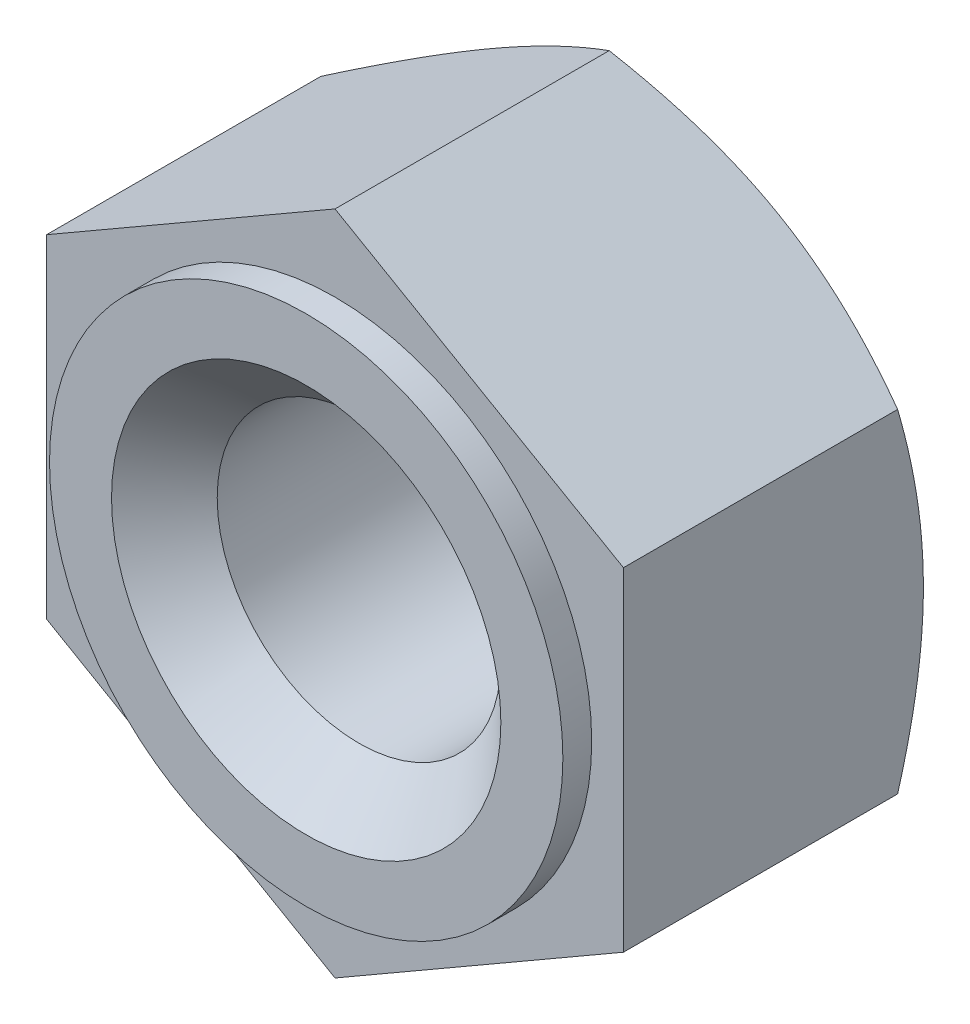
ISO-10303-21;
HEADER;
FILE_DESCRIPTION(('STEP AP214'),'2;1');
FILE_NAME('part.step','',(''),(''),'','','');
FILE_SCHEMA(('AUTOMOTIVE_DESIGN { 1 0 10303 214 1 1 1 1 }'));
ENDSEC;
DATA;
#1=APPLICATION_CONTEXT('core data for automotive mechanical design processes');
#2=APPLICATION_PROTOCOL_DEFINITION('international standard','automotive_design',2000,#1);
#3=PRODUCT_CONTEXT('',#1,'mechanical');
#4=PRODUCT('Part','Part','',(#3));
#5=PRODUCT_RELATED_PRODUCT_CATEGORY('part','',(#4));
#6=PRODUCT_DEFINITION_FORMATION('','',#4);
#7=PRODUCT_DEFINITION_CONTEXT('part definition',#1,'design');
#8=PRODUCT_DEFINITION('design','',#6,#7);
#9=PRODUCT_DEFINITION_SHAPE('','',#8);
#10=(LENGTH_UNIT() NAMED_UNIT(*) SI_UNIT(.MILLI.,.METRE.));
#11=(NAMED_UNIT(*) PLANE_ANGLE_UNIT() SI_UNIT($,.RADIAN.));
#12=(NAMED_UNIT(*) SI_UNIT($,.STERADIAN.) SOLID_ANGLE_UNIT());
#13=UNCERTAINTY_MEASURE_WITH_UNIT(LENGTH_MEASURE(1.E-05),#10,'distance_accuracy_value','');
#14=(GEOMETRIC_REPRESENTATION_CONTEXT(3) GLOBAL_UNCERTAINTY_ASSIGNED_CONTEXT((#13)) GLOBAL_UNIT_ASSIGNED_CONTEXT((#10,
#11,#12)) REPRESENTATION_CONTEXT('',''));
#15=CARTESIAN_POINT('',(0.,0.,0.));
#16=DIRECTION('',(0.,0.,1.));
#17=DIRECTION('',(1.,0.,0.));
#18=AXIS2_PLACEMENT_3D('',#15,#16,#17);
#19=CARTESIAN_POINT('',(5.,2.88675134594813,5.7));
#20=DIRECTION('',(-0.499999999999999,-0.866025403784439,0.));
#21=DIRECTION('',(0.866025403784439,-0.499999999999999,0.));
#22=AXIS2_PLACEMENT_3D('',#19,#20,#21);
#23=PLANE('',#22);
#24=DIRECTION('',(-0.866025403784439,0.499999999999999,0.));
#25=VECTOR('',#24,1.);
#26=CARTESIAN_POINT('',(5.,2.88675134594813,5.2));
#27=LINE('',#26,#25);
#28=CARTESIAN_POINT('',(5.,2.88675134594813,5.2));
#29=VERTEX_POINT('',#28);
#30=CARTESIAN_POINT('',(0.,5.77350269189625,5.2));
#31=VERTEX_POINT('',#30);
#32=EDGE_CURVE('E114',#29,#31,#27,.T.);
#33=ORIENTED_EDGE('',*,*,#32,.F.);
#34=DIRECTION('',(0.,0.,-1.));
#35=VECTOR('',#34,1.);
#36=CARTESIAN_POINT('',(5.,2.88675134594813,5.7));
#37=LINE('',#36,#35);
#38=CARTESIAN_POINT('',(5.,2.88675134594813,0.446581987385202));
#39=VERTEX_POINT('',#38);
#40=EDGE_CURVE('E122',#29,#39,#37,.T.);
#41=ORIENTED_EDGE('',*,*,#40,.T.);
#42=CARTESIAN_POINT('',(-0.000200000000000224,5.77361816195009,0.446648656051826));
#43=CARTESIAN_POINT('',(0.219534594525184,5.6467543346507,0.373386567637632));
#44=CARTESIAN_POINT('',(0.44114858445958,5.51880543790589,0.306751321918089));
#45=CARTESIAN_POINT('',(0.888213995453513,5.26069210252317,0.190438991010808));
#46=CARTESIAN_POINT('',(1.11367335959077,5.13052307794721,0.140803049915787));
#47=CARTESIAN_POINT('',(1.56183230522351,4.87177839004641,0.0635510254186963));
#48=CARTESIAN_POINT('',(1.78446209310419,4.74324302208387,0.0354203782834881));
#49=CARTESIAN_POINT('',(2.11918990184664,4.54998783160116,0.0101949219536832));
#50=CARTESIAN_POINT('',(2.23084219680506,4.48552534905128,0.00461345976948266));
#51=CARTESIAN_POINT('',(2.4542499706738,4.35654081066911,-0.000797783248530825));
#52=CARTESIAN_POINT('',(2.56600544629031,4.2920187567385,-0.000627741741797352));
#53=CARTESIAN_POINT('',(2.87218423085064,4.11524635305244,0.00775363179203639));
#54=CARTESIAN_POINT('',(3.06650608596721,4.00305457769146,0.0218297718972515));
#55=CARTESIAN_POINT('',(3.45386010199771,3.77941563226457,0.0664652571094308));
#56=CARTESIAN_POINT('',(3.64689090137157,3.66796924828418,0.0970398601475079));
#57=CARTESIAN_POINT('',(4.03502534247485,3.44387972423144,0.173468493621164));
#58=CARTESIAN_POINT('',(4.23007999864173,3.3312648659868,0.21964637887868));
#59=CARTESIAN_POINT('',(4.61728034535877,3.10771464157941,0.324451794491934));
#60=CARTESIAN_POINT('',(4.80943099540808,2.99677641204847,0.383054703437374));
#61=CARTESIAN_POINT('',(5.0002,2.88663587589429,0.446648656051828));
#62=B_SPLINE_CURVE_WITH_KNOTS('',3,(#42,#43,#44,#45,#46,#47,#48,#49,#50,#51,#52,#53,#54,#55,#56,
#57,#58,#59,#60,#61),.UNSPECIFIED.,.F.,.F.,(4,2,2,2,2,2,2,2,2,4),(0.,0.79255584136309,
1.58701660053333,2.3618153748728,2.74884076077325,3.13585419177295,3.80962362599679,
4.48401723901189,5.17336882348928,5.86136694793725),.UNSPECIFIED.);
#63=CARTESIAN_POINT('',(2.5,4.3301270189222,0.));
#64=VERTEX_POINT('',#63);
#65=EDGE_CURVE('E191',#64,#39,#62,.T.);
#66=ORIENTED_EDGE('',*,*,#65,.F.);
#67=CARTESIAN_POINT('',(0.,5.77350269189625,0.446581987385199));
#68=VERTEX_POINT('',#67);
#69=EDGE_CURVE('E200',#68,#64,#62,.T.);
#70=ORIENTED_EDGE('',*,*,#69,.F.);
#71=DIRECTION('',(0.,0.,-1.));
#72=VECTOR('',#71,1.);
#73=CARTESIAN_POINT('',(0.,5.77350269189625,5.7));
#74=LINE('',#73,#72);
#75=EDGE_CURVE('E124',#31,#68,#74,.T.);
#76=ORIENTED_EDGE('',*,*,#75,.F.);
#77=EDGE_LOOP('',(#33,#41,#66,#70,#76));
#78=FACE_BOUND('',#77,.T.);
#79=ADVANCED_FACE('F44',(#78),#23,.F.);
#80=CARTESIAN_POINT('',(0.,5.77350269189625,5.7));
#81=DIRECTION('',(0.499999999999999,-0.866025403784439,0.));
#82=DIRECTION('',(0.866025403784439,0.499999999999999,0.));
#83=AXIS2_PLACEMENT_3D('',#80,#81,#82);
#84=PLANE('',#83);
#85=DIRECTION('',(-0.866025403784439,-0.499999999999999,0.));
#86=VECTOR('',#85,1.);
#87=CARTESIAN_POINT('',(0.,5.77350269189625,5.2));
#88=LINE('',#87,#86);
#89=CARTESIAN_POINT('',(-5.,2.88675134594813,5.2));
#90=VERTEX_POINT('',#89);
#91=EDGE_CURVE('E126',#31,#90,#88,.T.);
#92=ORIENTED_EDGE('',*,*,#91,.F.);
#93=ORIENTED_EDGE('',*,*,#75,.T.);
#94=CARTESIAN_POINT('',(-5.0002,2.88663587589429,0.44664865605183));
#95=CARTESIAN_POINT('',(-4.78046540547482,3.01349970319368,0.373386567637636));
#96=CARTESIAN_POINT('',(-4.55885141554042,3.14144859993849,0.306751321918093));
#97=CARTESIAN_POINT('',(-4.11178600454649,3.39956193532121,0.190438991010812));
#98=CARTESIAN_POINT('',(-3.88632664040923,3.52973095989718,0.14080304991579));
#99=CARTESIAN_POINT('',(-3.43816769477649,3.78847564779798,0.0635510254186985));
#100=CARTESIAN_POINT('',(-3.21553790689581,3.91701101576052,0.0354203782834898));
#101=CARTESIAN_POINT('',(-2.88081009815336,4.11026620624323,0.0101949219536843));
#102=CARTESIAN_POINT('',(-2.76915780319494,4.17472868879311,0.00461345976948345));
#103=CARTESIAN_POINT('',(-2.5457500293262,4.30371322717528,-0.000797783248530365));
#104=CARTESIAN_POINT('',(-2.43399455370968,4.36823528110589,-0.000627741741796995));
#105=CARTESIAN_POINT('',(-2.12781576914936,4.54500768479194,0.00775363179203645));
#106=CARTESIAN_POINT('',(-1.93349391403278,4.65719946015292,0.0218297718972514));
#107=CARTESIAN_POINT('',(-1.54613989800229,4.88083840557981,0.0664652571094301));
#108=CARTESIAN_POINT('',(-1.35310909862843,4.9922847895602,0.097039860147507));
#109=CARTESIAN_POINT('',(-0.964974657525145,5.21637431361295,0.173468493621162));
#110=CARTESIAN_POINT('',(-0.769920001358263,5.32898917185758,0.219646378878678));
#111=CARTESIAN_POINT('',(-0.382719654641231,5.55253939626498,0.324451794491932));
#112=CARTESIAN_POINT('',(-0.190569004591914,5.66347762579591,0.383054703437372));
#113=CARTESIAN_POINT('',(0.000200000000000153,5.77361816195009,0.446648656051826));
#114=B_SPLINE_CURVE_WITH_KNOTS('',3,(#94,#95,#96,#97,#98,#99,#100,#101,#102,#103,#104,#105,#106,
#107,#108,#109,#110,#111,#112,#113),.UNSPECIFIED.,.F.,.F.,(4,2,2,2,2,2,2,2,2,4),(0.,
0.792555841363091,1.58701660053334,2.36181537487281,2.74884076077326,3.13585419177295,
3.80962362599679,4.48401723901189,5.17336882348929,5.86136694793725),.UNSPECIFIED.);
#115=CARTESIAN_POINT('',(-2.49999999999999,4.3301270189222,0.));
#116=VERTEX_POINT('',#115);
#117=EDGE_CURVE('E255',#116,#68,#114,.T.);
#118=ORIENTED_EDGE('',*,*,#117,.F.);
#119=CARTESIAN_POINT('',(-5.,2.88675134594813,0.446581987385204));
#120=VERTEX_POINT('',#119);
#121=EDGE_CURVE('E262',#120,#116,#114,.T.);
#122=ORIENTED_EDGE('',*,*,#121,.F.);
#123=DIRECTION('',(0.,0.,-1.));
#124=VECTOR('',#123,1.);
#125=CARTESIAN_POINT('',(-5.,2.88675134594813,5.7));
#126=LINE('',#125,#124);
#127=EDGE_CURVE('E151',#90,#120,#126,.T.);
#128=ORIENTED_EDGE('',*,*,#127,.F.);
#129=EDGE_LOOP('',(#92,#93,#118,#122,#128));
#130=FACE_BOUND('',#129,.T.);
#131=ADVANCED_FACE('F209',(#130),#84,.F.);
#132=CARTESIAN_POINT('',(-5.,2.88675134594813,5.7));
#133=DIRECTION('',(1.,0.,0.));
#134=DIRECTION('',(0.,1.,0.));
#135=AXIS2_PLACEMENT_3D('',#132,#133,#134);
#136=PLANE('',#135);
#137=DIRECTION('',(0.,-1.,0.));
#138=VECTOR('',#137,1.);
#139=CARTESIAN_POINT('',(-5.,2.88675134594813,5.2));
#140=LINE('',#139,#138);
#141=CARTESIAN_POINT('',(-5.,-2.88675134594813,5.2));
#142=VERTEX_POINT('',#141);
#143=EDGE_CURVE('E276',#90,#142,#140,.T.);
#144=ORIENTED_EDGE('',*,*,#143,.F.);
#145=ORIENTED_EDGE('',*,*,#127,.T.);
#146=CARTESIAN_POINT('',(-4.99999999999999,-7.77226399787202,2.44891754847105));
#147=CARTESIAN_POINT('',(-4.99999999999999,-7.55366239094537,2.34280354064155));
#148=CARTESIAN_POINT('',(-4.99999999999999,-7.33456076700476,2.23770204178195));
#149=CARTESIAN_POINT('',(-4.99999999999999,-6.89509151717976,2.03009339022649));
#150=CARTESIAN_POINT('',(-5.,-6.67472369974202,1.92758664346648));
#151=CARTESIAN_POINT('',(-5.,-6.23133015830568,1.72522535931696));
#152=CARTESIAN_POINT('',(-5.,-6.00829650774623,1.62538813012932));
#153=CARTESIAN_POINT('',(-5.,-5.56046080470875,1.42977736281631));
#154=CARTESIAN_POINT('',(-5.,-5.33565883601108,1.33400363352649));
#155=CARTESIAN_POINT('',(-5.,-4.87674142153371,1.14462658573202));
#156=CARTESIAN_POINT('',(-5.,-4.64255714693798,1.05118915476965));
#157=CARTESIAN_POINT('',(-5.,-4.1714558844755,0.871342320665165));
#158=CARTESIAN_POINT('',(-5.,-3.93453859454316,0.78493370304478));
#159=CARTESIAN_POINT('',(-5.,-3.45803135403745,0.621398568273529));
#160=CARTESIAN_POINT('',(-5.,-3.21844785051667,0.544253453476095));
#161=CARTESIAN_POINT('',(-5.,-2.73584493808901,0.401708183275468));
#162=CARTESIAN_POINT('',(-5.,-2.49282663062471,0.336304350997754));
#163=CARTESIAN_POINT('',(-5.,-2.00449804268892,0.220699180636844));
#164=CARTESIAN_POINT('',(-5.,-1.75920678755295,0.170418953135));
#165=CARTESIAN_POINT('',(-5.,-1.2655563725348,0.087915889441339));
#166=CARTESIAN_POINT('',(-5.,-1.01719753216282,0.0556911885838905));
#167=CARTESIAN_POINT('',(-5.,-0.5219037185924,0.0122905254264828));
#168=CARTESIAN_POINT('',(-5.,-0.274993190464603,0.000842468159120667));
#169=CARTESIAN_POINT('',(-5.,0.21892146558765,-0.000751708222695808));
#170=CARTESIAN_POINT('',(-5.,0.465925596356513,0.00910288239737813));
#171=CARTESIAN_POINT('',(-5.,0.88461531871465,0.04316414828364));
#172=CARTESIAN_POINT('',(-5.,1.05674744628304,0.0622009764856298));
#173=CARTESIAN_POINT('',(-5.,1.39975692218061,0.109445999396031));
#174=CARTESIAN_POINT('',(-5.,1.57063410001582,0.137655417530647));
#175=CARTESIAN_POINT('',(-5.,2.08114258345155,0.23456006765246));
#176=CARTESIAN_POINT('',(-5.,2.41847289941678,0.315515294263223));
#177=CARTESIAN_POINT('',(-5.,2.92312331076009,0.456013409855785));
#178=CARTESIAN_POINT('',(-5.,3.09305252124755,0.506718313728109));
#179=CARTESIAN_POINT('',(-5.,3.43125914123623,0.613414771156661));
#180=CARTESIAN_POINT('',(-5.,3.5995365379193,0.669406365702111));
#181=CARTESIAN_POINT('',(-5.,3.93449615932393,0.785775670311434));
#182=CARTESIAN_POINT('',(-5.,4.10117885645389,0.846152032854898));
#183=CARTESIAN_POINT('',(-5.,4.43315830772648,0.970578271845369));
#184=CARTESIAN_POINT('',(-5.,4.59845509599366,1.03462805753718));
#185=CARTESIAN_POINT('',(-5.,5.05610587745142,1.21686760997884));
#186=CARTESIAN_POINT('',(-5.,5.34714027421057,1.33836848265002));
#187=CARTESIAN_POINT('',(-5.,5.92615839520299,1.58845952617261));
#188=CARTESIAN_POINT('',(-5.00000000000001,6.21414175563081,1.71705053135722));
#189=CARTESIAN_POINT('',(-5.00000000000001,6.78779216374427,1.97958027902555));
#190=CARTESIAN_POINT('',(-5.00000000000001,7.07345823536119,2.113521147167));
#191=CARTESIAN_POINT('',(-5.00000000000001,7.6428473517712,2.38542556262518));
#192=CARTESIAN_POINT('',(-5.00000000000001,7.92657048121857,2.52338893328602));
#193=CARTESIAN_POINT('',(-5.00000000000001,8.49293975249698,2.80266266418884));
#194=CARTESIAN_POINT('',(-5.00000000000001,8.77558336679528,2.94397813979048));
#195=CARTESIAN_POINT('',(-5.00000000000001,9.33962401230618,3.2290770880519));
#196=CARTESIAN_POINT('',(-5.00000000000001,9.62102103219938,3.37286058306435));
#197=CARTESIAN_POINT('',(-5.00000000000001,10.4635710490022,3.80707115109393));
#198=CARTESIAN_POINT('',(-5.00000000000001,11.0232153647209,4.10042420860211));
#199=CARTESIAN_POINT('',(-5.00000000000001,12.0782888153048,4.65969847347627));
#200=CARTESIAN_POINT('',(-5.00000000000001,12.5740034882315,4.92508355921189));
#201=CARTESIAN_POINT('',(-5.00000000000001,13.5638599040101,5.45884653492957));
#202=CARTESIAN_POINT('',(-5.00000000000001,14.0580015422529,5.72722461881813));
#203=CARTESIAN_POINT('',(-5.00000000000001,15.0434300689524,6.26528257659641));
#204=CARTESIAN_POINT('',(-5.00000000000001,15.5347209782385,6.53495509761013));
#205=CARTESIAN_POINT('',(-5.00000000000001,16.5163245212106,7.07598199696795));
#206=CARTESIAN_POINT('',(-5.00000000000001,17.0066372306617,7.34733623779579));
#207=CARTESIAN_POINT('',(-5.00000000000001,17.496609596203,7.61930004300452));
#208=B_SPLINE_CURVE_WITH_KNOTS('',3,(#146,#147,#148,#149,#150,#151,#152,#153,#154,#155,#156,
#157,#158,#159,#160,#161,#162,#163,#164,#165,#166,#167,#168,#169,#170,#171,#172,#173,#174,#175,
#176,#177,#178,#179,#180,#181,#182,#183,#184,#185,#186,#187,#188,#189,#190,#191,#192,#193,#194,
#195,#196,#197,#198,#199,#200,#201,#202,#203,#204,#205,#206,#207),.UNSPECIFIED.,.F.,.F.,(4,2,2,
2,2,2,2,2,2,2,2,2,2,2,2,2,2,2,2,2,2,2,2,2,2,2,2,2,2,2,4),(0.,0.728995531263041,1.45810441401404,
2.19114993672596,2.92416093551063,3.68048330353608,4.43689008036677,5.19175194410207,
5.94637700299617,6.69699457071543,7.44753460489535,8.18817247315954,8.92883501743454,
9.44812860491786,9.9674914834269,11.0067508900767,11.5387037065435,12.0706606477309,
12.6024547949036,13.1342358092818,14.0802265048629,15.0263287587205,15.9728107410075,
16.9192512191552,17.8672429974834,18.8152433662391,20.7108005686318,22.3976396014021,
24.0845885612416,25.7658971284509,27.4470699807868),.UNSPECIFIED.);
#209=CARTESIAN_POINT('',(-5.,0.,0.));
#210=VERTEX_POINT('',#209);
#211=EDGE_CURVE('E138',#210,#120,#208,.T.);
#212=ORIENTED_EDGE('',*,*,#211,.F.);
#213=CARTESIAN_POINT('',(-5.,-2.88675134594813,0.446581987385202));
#214=VERTEX_POINT('',#213);
#215=EDGE_CURVE('E133',#214,#210,#208,.T.);
#216=ORIENTED_EDGE('',*,*,#215,.F.);
#217=DIRECTION('',(0.,0.,-1.));
#218=VECTOR('',#217,1.);
#219=CARTESIAN_POINT('',(-5.,-2.88675134594813,5.7));
#220=LINE('',#219,#218);
#221=EDGE_CURVE('E149',#142,#214,#220,.T.);
#222=ORIENTED_EDGE('',*,*,#221,.F.);
#223=EDGE_LOOP('',(#144,#145,#212,#216,#222));
#224=FACE_BOUND('',#223,.T.);
#225=ADVANCED_FACE('F339',(#224),#136,.F.);
#226=CARTESIAN_POINT('',(-5.,-2.88675134594813,5.7));
#227=DIRECTION('',(0.499999999999999,0.866025403784439,0.));
#228=DIRECTION('',(-0.866025403784439,0.5,0.));
#229=AXIS2_PLACEMENT_3D('',#226,#227,#228);
#230=PLANE('',#229);
#231=DIRECTION('',(0.866025403784439,-0.5,0.));
#232=VECTOR('',#231,1.);
#233=CARTESIAN_POINT('',(-5.,-2.88675134594813,5.2));
#234=LINE('',#233,#232);
#235=CARTESIAN_POINT('',(0.,-5.77350269189626,5.2));
#236=VERTEX_POINT('',#235);
#237=EDGE_CURVE('E278',#142,#236,#234,.T.);
#238=ORIENTED_EDGE('',*,*,#237,.F.);
#239=ORIENTED_EDGE('',*,*,#221,.T.);
#240=CARTESIAN_POINT('',(0.000199999999998699,-5.77361816195009,0.446648656051827));
#241=CARTESIAN_POINT('',(-0.219534594525187,-5.6467543346507,0.373386567637633));
#242=CARTESIAN_POINT('',(-0.441148584459582,-5.51880543790589,0.30675132191809));
#243=CARTESIAN_POINT('',(-0.888213995453515,-5.26069210252318,0.19043899101081));
#244=CARTESIAN_POINT('',(-1.11367335959078,-5.13052307794721,0.140803049915788));
#245=CARTESIAN_POINT('',(-1.56183230522351,-4.87177839004641,0.0635510254186978));
#246=CARTESIAN_POINT('',(-1.78446209310419,-4.74324302208387,0.0354203782834888));
#247=CARTESIAN_POINT('',(-2.11918990184664,-4.54998783160116,0.0101949219536842));
#248=CARTESIAN_POINT('',(-2.23084219680506,-4.48552534905128,0.00461345976948385));
#249=CARTESIAN_POINT('',(-2.4542499706738,-4.35654081066911,-0.000797783248529517));
#250=CARTESIAN_POINT('',(-2.56600544629032,-4.2920187567385,-0.00062774174179617));
#251=CARTESIAN_POINT('',(-2.87218423085064,-4.11524635305244,0.0077536317920374));
#252=CARTESIAN_POINT('',(-3.06650608596721,-4.00305457769146,0.0218297718972525));
#253=CARTESIAN_POINT('',(-3.45386010199771,-3.77941563226457,0.0664652571094318));
#254=CARTESIAN_POINT('',(-3.64689090137157,-3.66796924828419,0.0970398601475089));
#255=CARTESIAN_POINT('',(-4.03502534247485,-3.44387972423144,0.173468493621164));
#256=CARTESIAN_POINT('',(-4.23007999864174,-3.3312648659868,0.219646378878681));
#257=CARTESIAN_POINT('',(-4.61728034535877,-3.10771464157941,0.324451794491935));
#258=CARTESIAN_POINT('',(-4.80943099540808,-2.99677641204847,0.383054703437374));
#259=CARTESIAN_POINT('',(-5.0002,-2.88663587589429,0.446648656051828));
#260=B_SPLINE_CURVE_WITH_KNOTS('',3,(#240,#241,#242,#243,#244,#245,#246,#247,#248,#249,#250,
#251,#252,#253,#254,#255,#256,#257,#258,#259),.UNSPECIFIED.,.F.,.F.,(4,2,2,2,2,2,2,2,2,4),(0.,
0.792555841363091,1.58701660053333,2.3618153748728,2.74884076077325,3.13585419177295,
3.80962362599679,4.48401723901189,5.17336882348928,5.86136694793725),.UNSPECIFIED.);
#261=CARTESIAN_POINT('',(-2.5,-4.3301270189222,0.));
#262=VERTEX_POINT('',#261);
#263=EDGE_CURVE('E256',#262,#214,#260,.T.);
#264=ORIENTED_EDGE('',*,*,#263,.F.);
#265=CARTESIAN_POINT('',(0.,-5.77350269189626,0.446581987385201));
#266=VERTEX_POINT('',#265);
#267=EDGE_CURVE('E201',#266,#262,#260,.T.);
#268=ORIENTED_EDGE('',*,*,#267,.F.);
#269=DIRECTION('',(0.,0.,-1.));
#270=VECTOR('',#269,1.);
#271=CARTESIAN_POINT('',(0.,-5.77350269189626,5.7));
#272=LINE('',#271,#270);
#273=EDGE_CURVE('E135',#236,#266,#272,.T.);
#274=ORIENTED_EDGE('',*,*,#273,.F.);
#275=EDGE_LOOP('',(#238,#239,#264,#268,#274));
#276=FACE_BOUND('',#275,.T.);
#277=ADVANCED_FACE('F179',(#276),#230,.F.);
#278=CARTESIAN_POINT('',(0.,-5.77350269189626,5.7));
#279=DIRECTION('',(-0.499999999999999,0.866025403784439,0.));
#280=DIRECTION('',(-0.866025403784439,-0.499999999999999,0.));
#281=AXIS2_PLACEMENT_3D('',#278,#279,#280);
#282=PLANE('',#281);
#283=DIRECTION('',(0.866025403784439,0.499999999999999,0.));
#284=VECTOR('',#283,1.);
#285=CARTESIAN_POINT('',(0.,-5.77350269189626,5.2));
#286=LINE('',#285,#284);
#287=CARTESIAN_POINT('',(5.,-2.88675134594813,5.2));
#288=VERTEX_POINT('',#287);
#289=EDGE_CURVE('E58',#236,#288,#286,.T.);
#290=ORIENTED_EDGE('',*,*,#289,.F.);
#291=ORIENTED_EDGE('',*,*,#273,.T.);
#292=CARTESIAN_POINT('',(5.0002,-2.88663587589429,0.446648656051829));
#293=CARTESIAN_POINT('',(4.78046540547481,-3.01349970319368,0.373386567637635));
#294=CARTESIAN_POINT('',(4.55885141554042,-3.14144859993849,0.306751321918092));
#295=CARTESIAN_POINT('',(4.11178600454648,-3.39956193532121,0.190438991010811));
#296=CARTESIAN_POINT('',(3.88632664040922,-3.52973095989718,0.140803049915789));
#297=CARTESIAN_POINT('',(3.43816769477649,-3.78847564779798,0.0635510254186977));
#298=CARTESIAN_POINT('',(3.21553790689581,-3.91701101576052,0.0354203782834891));
#299=CARTESIAN_POINT('',(2.88081009815336,-4.11026620624323,0.0101949219536842));
#300=CARTESIAN_POINT('',(2.76915780319494,-4.17472868879311,0.00461345976948365));
#301=CARTESIAN_POINT('',(2.5457500293262,-4.30371322717528,-0.000797783248530069));
#302=CARTESIAN_POINT('',(2.43399455370968,-4.36823528110589,-0.000627741741796852));
#303=CARTESIAN_POINT('',(2.12781576914936,-4.54500768479194,0.00775363179203653));
#304=CARTESIAN_POINT('',(1.93349391403278,-4.65719946015293,0.0218297718972517));
#305=CARTESIAN_POINT('',(1.54613989800229,-4.88083840557981,0.066465257109431));
#306=CARTESIAN_POINT('',(1.35310909862843,-4.9922847895602,0.0970398601475081));
#307=CARTESIAN_POINT('',(0.964974657525143,-5.21637431361295,0.173468493621163));
#308=CARTESIAN_POINT('',(0.769920001358262,-5.32898917185759,0.219646378878679));
#309=CARTESIAN_POINT('',(0.38271965464123,-5.55253939626498,0.324451794491933));
#310=CARTESIAN_POINT('',(0.190569004591912,-5.66347762579591,0.383054703437373));
#311=CARTESIAN_POINT('',(-0.000200000000001343,-5.77361816195009,0.446648656051827));
#312=B_SPLINE_CURVE_WITH_KNOTS('',3,(#292,#293,#294,#295,#296,#297,#298,#299,#300,#301,#302,
#303,#304,#305,#306,#307,#308,#309,#310,#311),.UNSPECIFIED.,.F.,.F.,(4,2,2,2,2,2,2,2,2,4),(0.,
0.792555841363092,1.58701660053334,2.36181537487281,2.74884076077325,3.13585419177295,
3.80962362599679,4.48401723901189,5.17336882348928,5.86136694793725),.UNSPECIFIED.);
#313=CARTESIAN_POINT('',(2.5,-4.3301270189222,0.));
#314=VERTEX_POINT('',#313);
#315=EDGE_CURVE('E193',#314,#266,#312,.T.);
#316=ORIENTED_EDGE('',*,*,#315,.F.);
#317=CARTESIAN_POINT('',(5.,-2.88675134594879,0.446581987384761));
#318=VERTEX_POINT('',#317);
#319=EDGE_CURVE('E183',#318,#314,#312,.T.);
#320=ORIENTED_EDGE('',*,*,#319,.F.);
#321=DIRECTION('',(0.,0.,-1.));
#322=VECTOR('',#321,1.);
#323=CARTESIAN_POINT('',(5.,-2.88675134594813,5.7));
#324=LINE('',#323,#322);
#325=EDGE_CURVE('E132',#288,#318,#324,.T.);
#326=ORIENTED_EDGE('',*,*,#325,.F.);
#327=EDGE_LOOP('',(#290,#291,#316,#320,#326));
#328=FACE_BOUND('',#327,.T.);
#329=ADVANCED_FACE('F173',(#328),#282,.F.);
#330=CARTESIAN_POINT('',(5.,-2.88675134594813,5.7));
#331=DIRECTION('',(-1.,0.,0.));
#332=DIRECTION('',(0.,-1.,0.));
#333=AXIS2_PLACEMENT_3D('',#330,#331,#332);
#334=PLANE('',#333);
#335=DIRECTION('',(0.,1.,0.));
#336=VECTOR('',#335,1.);
#337=CARTESIAN_POINT('',(5.,-2.88675134594813,5.2));
#338=LINE('',#337,#336);
#339=EDGE_CURVE('E12',#288,#29,#338,.T.);
#340=ORIENTED_EDGE('',*,*,#339,.F.);
#341=ORIENTED_EDGE('',*,*,#325,.T.);
#342=CARTESIAN_POINT('',(5.,-7.77226399787202,2.44891754847105));
#343=CARTESIAN_POINT('',(5.,-7.55366239094537,2.34280354064156));
#344=CARTESIAN_POINT('',(5.,-7.33456076700476,2.23770204178195));
#345=CARTESIAN_POINT('',(5.,-6.89509151717976,2.03009339022649));
#346=CARTESIAN_POINT('',(5.,-6.67472369974202,1.92758664346648));
#347=CARTESIAN_POINT('',(5.,-6.23133015830568,1.72522535931696));
#348=CARTESIAN_POINT('',(5.,-6.00829650774623,1.62538813012932));
#349=CARTESIAN_POINT('',(5.,-5.56046080470874,1.42977736281631));
#350=CARTESIAN_POINT('',(5.,-5.33565883601108,1.33400363352649));
#351=CARTESIAN_POINT('',(5.,-4.87674142153371,1.14462658573203));
#352=CARTESIAN_POINT('',(5.,-4.64255714693798,1.05118915476965));
#353=CARTESIAN_POINT('',(5.,-4.1714558844755,0.871342320665167));
#354=CARTESIAN_POINT('',(5.,-3.93453859454316,0.784933703044781));
#355=CARTESIAN_POINT('',(5.,-3.45803135403745,0.62139856827353));
#356=CARTESIAN_POINT('',(5.,-3.21844785051667,0.544253453476096));
#357=CARTESIAN_POINT('',(5.,-2.73584493808901,0.401708183275469));
#358=CARTESIAN_POINT('',(5.,-2.49282663062471,0.336304350997755));
#359=CARTESIAN_POINT('',(5.,-2.00449804268892,0.220699180636845));
#360=CARTESIAN_POINT('',(5.,-1.75920678755295,0.170418953135));
#361=CARTESIAN_POINT('',(5.,-1.2655563725348,0.087915889441339));
#362=CARTESIAN_POINT('',(5.,-1.01719753216282,0.0556911885838903));
#363=CARTESIAN_POINT('',(5.,-0.521903718592399,0.0122905254264824));
#364=CARTESIAN_POINT('',(5.,-0.274993190464602,0.000842468159120085));
#365=CARTESIAN_POINT('',(5.,0.218921465587651,-0.000751708222696694));
#366=CARTESIAN_POINT('',(5.,0.465925596356514,0.00910288239737709));
#367=CARTESIAN_POINT('',(5.,0.884615318714651,0.0431641482836387));
#368=CARTESIAN_POINT('',(5.,1.05674744628304,0.0622009764856285));
#369=CARTESIAN_POINT('',(5.,1.39975692218061,0.109445999396029));
#370=CARTESIAN_POINT('',(5.,1.57063410001582,0.137655417530645));
#371=CARTESIAN_POINT('',(5.,2.08114258345155,0.234560067652458));
#372=CARTESIAN_POINT('',(5.,2.41847289941678,0.315515294263221));
#373=CARTESIAN_POINT('',(5.,2.92312331076009,0.456013409855782));
#374=CARTESIAN_POINT('',(5.,3.09305252124754,0.506718313728106));
#375=CARTESIAN_POINT('',(5.,3.43125914123623,0.613414771156658));
#376=CARTESIAN_POINT('',(5.,3.5995365379193,0.669406365702107));
#377=CARTESIAN_POINT('',(5.,3.93449615932393,0.78577567031143));
#378=CARTESIAN_POINT('',(5.,4.10117885645389,0.846152032854895));
#379=CARTESIAN_POINT('',(5.,4.43315830772647,0.970578271845365));
#380=CARTESIAN_POINT('',(5.,4.59845509599366,1.03462805753717));
#381=CARTESIAN_POINT('',(5.,5.05610587745141,1.21686760997884));
#382=CARTESIAN_POINT('',(5.,5.34714027421057,1.33836848265002));
#383=CARTESIAN_POINT('',(5.,5.92615839520298,1.58845952617261));
#384=CARTESIAN_POINT('',(5.,6.2141417556308,1.71705053135722));
#385=CARTESIAN_POINT('',(5.,6.78779216374426,1.97958027902555));
#386=CARTESIAN_POINT('',(5.,7.07345823536119,2.113521147167));
#387=CARTESIAN_POINT('',(5.,7.6428473517712,2.38542556262517));
#388=CARTESIAN_POINT('',(5.,7.92657048121856,2.52338893328601));
#389=CARTESIAN_POINT('',(5.,8.49293975249697,2.80266266418883));
#390=CARTESIAN_POINT('',(5.,8.77558336679528,2.94397813979048));
#391=CARTESIAN_POINT('',(5.,9.33962401230617,3.2290770880519));
#392=CARTESIAN_POINT('',(5.,9.62102103219938,3.37286058306435));
#393=CARTESIAN_POINT('',(5.,10.4635710490022,3.80707115109392));
#394=CARTESIAN_POINT('',(5.,11.0232153647209,4.10042420860211));
#395=CARTESIAN_POINT('',(5.,12.0782888153048,4.65969847347626));
#396=CARTESIAN_POINT('',(4.99999999999999,12.5740034882315,4.92508355921188));
#397=CARTESIAN_POINT('',(4.99999999999999,13.5638599040101,5.45884653492956));
#398=CARTESIAN_POINT('',(4.99999999999999,14.0580015422529,5.72722461881812));
#399=CARTESIAN_POINT('',(4.99999999999999,15.0434300689524,6.2652825765964));
#400=CARTESIAN_POINT('',(4.99999999999999,15.5347209782385,6.53495509761013));
#401=CARTESIAN_POINT('',(4.99999999999999,16.5163245212105,7.07598199696795));
#402=CARTESIAN_POINT('',(4.99999999999999,17.0066372306617,7.34733623779578));
#403=CARTESIAN_POINT('',(4.99999999999999,17.496609596203,7.61930004300452));
#404=B_SPLINE_CURVE_WITH_KNOTS('',3,(#342,#343,#344,#345,#346,#347,#348,#349,#350,#351,#352,
#353,#354,#355,#356,#357,#358,#359,#360,#361,#362,#363,#364,#365,#366,#367,#368,#369,#370,#371,
#372,#373,#374,#375,#376,#377,#378,#379,#380,#381,#382,#383,#384,#385,#386,#387,#388,#389,#390,
#391,#392,#393,#394,#395,#396,#397,#398,#399,#400,#401,#402,#403),.UNSPECIFIED.,.F.,.F.,(4,2,2,
2,2,2,2,2,2,2,2,2,2,2,2,2,2,2,2,2,2,2,2,2,2,2,2,2,2,2,4),(0.,0.728995531263041,1.45810441401404,
2.19114993672596,2.92416093551063,3.68048330353608,4.43689008036678,5.19175194410207,
5.94637700299617,6.69699457071543,7.44753460489535,8.18817247315954,8.92883501743454,
9.44812860491787,9.9674914834269,11.0067508900767,11.5387037065435,12.0706606477309,
12.6024547949035,13.1342358092818,14.0802265048629,15.0263287587205,15.9728107410075,
16.9192512191552,17.8672429974834,18.8152433662391,20.7108005686318,22.3976396014021,
24.0845885612416,25.7658971284509,27.4470699807868),.UNSPECIFIED.);
#405=CARTESIAN_POINT('',(5.,0.,0.));
#406=VERTEX_POINT('',#405);
#407=EDGE_CURVE('E154',#406,#318,#404,.F.);
#408=ORIENTED_EDGE('',*,*,#407,.F.);
#409=EDGE_CURVE('E131',#39,#406,#404,.F.);
#410=ORIENTED_EDGE('',*,*,#409,.F.);
#411=ORIENTED_EDGE('',*,*,#40,.F.);
#412=EDGE_LOOP('',(#340,#341,#408,#410,#411));
#413=FACE_BOUND('',#412,.T.);
#414=ADVANCED_FACE('F129',(#413),#334,.F.);
#415=CARTESIAN_POINT('',(5.,2.88675134594813,5.7));
#416=DIRECTION('',(0.,0.,-1.));
#417=DIRECTION('',(-1.,0.,0.));
#418=AXIS2_PLACEMENT_3D('',#415,#416,#417);
#419=PLANE('',#418);
#420=CARTESIAN_POINT('',(0.,0.,5.7));
#421=DIRECTION('',(0.,0.,-1.));
#422=DIRECTION('',(-1.,0.,0.));
#423=AXIS2_PLACEMENT_3D('',#420,#421,#422);
#424=CIRCLE('',#423,3.375);
#425=CARTESIAN_POINT('',(-3.375,0.,5.7));
#426=VERTEX_POINT('',#425);
#427=EDGE_CURVE('E52',#426,#426,#424,.T.);
#428=ORIENTED_EDGE('',*,*,#427,.T.);
#429=EDGE_LOOP('',(#428));
#430=FACE_BOUND('',#429,.T.);
#431=CARTESIAN_POINT('',(0.,0.,5.7));
#432=DIRECTION('',(0.,0.,1.));
#433=DIRECTION('',(1.,0.,0.));
#434=AXIS2_PLACEMENT_3D('',#431,#432,#433);
#435=CIRCLE('',#434,4.45);
#436=CARTESIAN_POINT('',(4.45,0.,5.7));
#437=VERTEX_POINT('',#436);
#438=EDGE_CURVE('E284',#437,#437,#435,.T.);
#439=ORIENTED_EDGE('',*,*,#438,.T.);
#440=EDGE_LOOP('',(#439));
#441=FACE_BOUND('',#440,.T.);
#442=ADVANCED_FACE('F172',(#430,#441),#419,.F.);
#443=CARTESIAN_POINT('',(5.,2.88675134594813,0.));
#444=DIRECTION('',(0.,0.,-1.));
#445=DIRECTION('',(-1.,0.,0.));
#446=AXIS2_PLACEMENT_3D('',#443,#444,#445);
#447=PLANE('',#446);
#448=CARTESIAN_POINT('',(0.,0.,0.));
#449=DIRECTION('',(0.,0.,-1.));
#450=DIRECTION('',(-1.,0.,0.));
#451=AXIS2_PLACEMENT_3D('',#448,#449,#450);
#452=CIRCLE('',#451,3.375);
#453=CARTESIAN_POINT('',(-3.375,0.,0.));
#454=VERTEX_POINT('',#453);
#455=EDGE_CURVE('E162',#454,#454,#452,.F.);
#456=ORIENTED_EDGE('',*,*,#455,.T.);
#457=EDGE_LOOP('',(#456));
#458=FACE_BOUND('',#457,.T.);
#459=CARTESIAN_POINT('',(0.,0.,0.));
#460=DIRECTION('',(0.,0.,-1.));
#461=DIRECTION('',(-1.,0.,0.));
#462=AXIS2_PLACEMENT_3D('',#459,#460,#461);
#463=CIRCLE('',#462,5.);
#464=EDGE_CURVE('E125',#262,#210,#463,.T.);
#465=ORIENTED_EDGE('',*,*,#464,.T.);
#466=EDGE_CURVE('E192',#210,#116,#463,.T.);
#467=ORIENTED_EDGE('',*,*,#466,.T.);
#468=EDGE_CURVE('E246',#116,#64,#463,.T.);
#469=ORIENTED_EDGE('',*,*,#468,.T.);
#470=EDGE_CURVE('E66',#64,#406,#463,.T.);
#471=ORIENTED_EDGE('',*,*,#470,.T.);
#472=EDGE_CURVE('E236',#406,#314,#463,.T.);
#473=ORIENTED_EDGE('',*,*,#472,.T.);
#474=EDGE_CURVE('E242',#314,#262,#463,.T.);
#475=ORIENTED_EDGE('',*,*,#474,.T.);
#476=EDGE_LOOP('',(#465,#467,#469,#471,#473,#475));
#477=FACE_BOUND('',#476,.T.);
#478=ADVANCED_FACE('F174',(#458,#477),#447,.T.);
#479=CARTESIAN_POINT('',(0.,0.,5.7));
#480=DIRECTION('',(0.,0.,-1.));
#481=DIRECTION('',(-1.,0.,0.));
#482=AXIS2_PLACEMENT_3D('',#479,#480,#481);
#483=CYLINDRICAL_SURFACE('',#482,2.45875);
#484=CARTESIAN_POINT('',(0.,0.,0.916250000000002));
#485=DIRECTION('',(0.,0.,-1.));
#486=DIRECTION('',(-1.,0.,0.));
#487=AXIS2_PLACEMENT_3D('',#484,#485,#486);
#488=CIRCLE('',#487,2.45875);
#489=CARTESIAN_POINT('',(-2.45875,0.,0.916250000000002));
#490=VERTEX_POINT('',#489);
#491=EDGE_CURVE('E226',#490,#490,#488,.T.);
#492=ORIENTED_EDGE('',*,*,#491,.T.);
#493=EDGE_LOOP('',(#492));
#494=FACE_BOUND('',#493,.T.);
#495=CARTESIAN_POINT('',(0.,0.,4.78375));
#496=DIRECTION('',(0.,0.,-1.));
#497=DIRECTION('',(-1.,0.,0.));
#498=AXIS2_PLACEMENT_3D('',#495,#496,#497);
#499=CIRCLE('',#498,2.45875);
#500=CARTESIAN_POINT('',(-2.45875,0.,4.78375));
#501=VERTEX_POINT('',#500);
#502=EDGE_CURVE('E230',#501,#501,#499,.F.);
#503=ORIENTED_EDGE('',*,*,#502,.T.);
#504=EDGE_LOOP('',(#503));
#505=FACE_BOUND('',#504,.T.);
#506=ADVANCED_FACE('F375',(#494,#505),#483,.F.);
#507=CARTESIAN_POINT('',(0.,0.,0.));
#508=DIRECTION('',(0.,0.,1.));
#509=DIRECTION('',(-1.,0.,0.));
#510=AXIS2_PLACEMENT_3D('',#507,#508,#509);
#511=CONICAL_SURFACE('',#510,5.,1.0471975511966);
#512=ORIENTED_EDGE('',*,*,#319,.T.);
#513=ORIENTED_EDGE('',*,*,#472,.F.);
#514=ORIENTED_EDGE('',*,*,#407,.T.);
#515=EDGE_LOOP('',(#512,#513,#514));
#516=FACE_BOUND('',#515,.T.);
#517=ADVANCED_FACE('F237',(#516),#511,.T.);
#518=ORIENTED_EDGE('',*,*,#65,.T.);
#519=ORIENTED_EDGE('',*,*,#409,.T.);
#520=ORIENTED_EDGE('',*,*,#470,.F.);
#521=EDGE_LOOP('',(#518,#519,#520));
#522=FACE_BOUND('',#521,.T.);
#523=ADVANCED_FACE('F233',(#522),#511,.T.);
#524=ORIENTED_EDGE('',*,*,#267,.T.);
#525=ORIENTED_EDGE('',*,*,#474,.F.);
#526=ORIENTED_EDGE('',*,*,#315,.T.);
#527=EDGE_LOOP('',(#524,#525,#526));
#528=FACE_BOUND('',#527,.T.);
#529=ADVANCED_FACE('F222',(#528),#511,.T.);
#530=ORIENTED_EDGE('',*,*,#215,.T.);
#531=ORIENTED_EDGE('',*,*,#464,.F.);
#532=ORIENTED_EDGE('',*,*,#263,.T.);
#533=EDGE_LOOP('',(#530,#531,#532));
#534=FACE_BOUND('',#533,.T.);
#535=ADVANCED_FACE('F164',(#534),#511,.T.);
#536=ORIENTED_EDGE('',*,*,#211,.T.);
#537=ORIENTED_EDGE('',*,*,#121,.T.);
#538=ORIENTED_EDGE('',*,*,#466,.F.);
#539=EDGE_LOOP('',(#536,#537,#538));
#540=FACE_BOUND('',#539,.T.);
#541=ADVANCED_FACE('F220',(#540),#511,.T.);
#542=ORIENTED_EDGE('',*,*,#117,.T.);
#543=ORIENTED_EDGE('',*,*,#69,.T.);
#544=ORIENTED_EDGE('',*,*,#468,.F.);
#545=EDGE_LOOP('',(#542,#543,#544));
#546=FACE_BOUND('',#545,.T.);
#547=ADVANCED_FACE('F213',(#546),#511,.T.);
#548=CARTESIAN_POINT('',(0.,0.,0.));
#549=DIRECTION('',(0.,0.,-1.));
#550=DIRECTION('',(-1.,0.,0.));
#551=AXIS2_PLACEMENT_3D('',#548,#549,#550);
#552=CONICAL_SURFACE('',#551,3.375,0.785398163397447);
#553=ORIENTED_EDGE('',*,*,#491,.F.);
#554=EDGE_LOOP('',(#553));
#555=FACE_BOUND('',#554,.T.);
#556=ORIENTED_EDGE('',*,*,#455,.F.);
#557=EDGE_LOOP('',(#556));
#558=FACE_BOUND('',#557,.T.);
#559=ADVANCED_FACE('F211',(#555,#558),#552,.F.);
#560=CARTESIAN_POINT('',(0.,0.,4.78375));
#561=DIRECTION('',(0.,0.,1.));
#562=DIRECTION('',(1.,0.,0.));
#563=AXIS2_PLACEMENT_3D('',#560,#561,#562);
#564=CONICAL_SURFACE('',#563,2.45875,0.78539816339745);
#565=ORIENTED_EDGE('',*,*,#427,.F.);
#566=EDGE_LOOP('',(#565));
#567=FACE_BOUND('',#566,.T.);
#568=ORIENTED_EDGE('',*,*,#502,.F.);
#569=EDGE_LOOP('',(#568));
#570=FACE_BOUND('',#569,.T.);
#571=ADVANCED_FACE('F46',(#567,#570),#564,.F.);
#572=CARTESIAN_POINT('',(0.,0.,5.2));
#573=DIRECTION('',(0.,0.,1.));
#574=DIRECTION('',(1.,0.,0.));
#575=AXIS2_PLACEMENT_3D('',#572,#573,#574);
#576=PLANE('',#575);
#577=CARTESIAN_POINT('',(0.,0.,5.2));
#578=DIRECTION('',(0.,0.,1.));
#579=DIRECTION('',(1.,0.,0.));
#580=AXIS2_PLACEMENT_3D('',#577,#578,#579);
#581=CIRCLE('',#580,4.45);
#582=CARTESIAN_POINT('',(4.45,0.,5.2));
#583=VERTEX_POINT('',#582);
#584=EDGE_CURVE('E283',#583,#583,#581,.T.);
#585=ORIENTED_EDGE('',*,*,#584,.F.);
#586=EDGE_LOOP('',(#585));
#587=FACE_BOUND('',#586,.T.);
#588=ORIENTED_EDGE('',*,*,#32,.T.);
#589=ORIENTED_EDGE('',*,*,#91,.T.);
#590=ORIENTED_EDGE('',*,*,#143,.T.);
#591=ORIENTED_EDGE('',*,*,#237,.T.);
#592=ORIENTED_EDGE('',*,*,#289,.T.);
#593=ORIENTED_EDGE('',*,*,#339,.T.);
#594=EDGE_LOOP('',(#588,#589,#590,#591,#592,#593));
#595=FACE_BOUND('',#594,.T.);
#596=ADVANCED_FACE('F113',(#587,#595),#576,.T.);
#597=CARTESIAN_POINT('',(0.,0.,5.2));
#598=DIRECTION('',(0.,0.,1.));
#599=DIRECTION('',(1.,0.,0.));
#600=AXIS2_PLACEMENT_3D('',#597,#598,#599);
#601=CYLINDRICAL_SURFACE('',#600,4.45);
#602=ORIENTED_EDGE('',*,*,#584,.T.);
#603=EDGE_LOOP('',(#602));
#604=FACE_BOUND('',#603,.T.);
#605=ORIENTED_EDGE('',*,*,#438,.F.);
#606=EDGE_LOOP('',(#605));
#607=FACE_BOUND('',#606,.T.);
#608=ADVANCED_FACE('F290',(#604,#607),#601,.T.);
#609=CLOSED_SHELL('',(#79,#131,#225,#277,#329,#414,#442,#478,#506,#517,#523,#529,#535,#541,#547,
#559,#571,#596,#608));
#610=MANIFOLD_SOLID_BREP('B2',#609);
#611=ADVANCED_BREP_SHAPE_REPRESENTATION('',(#18,#610),#14);
#612=SHAPE_DEFINITION_REPRESENTATION(#9,#611);
ENDSEC;
END-ISO-10303-21;
